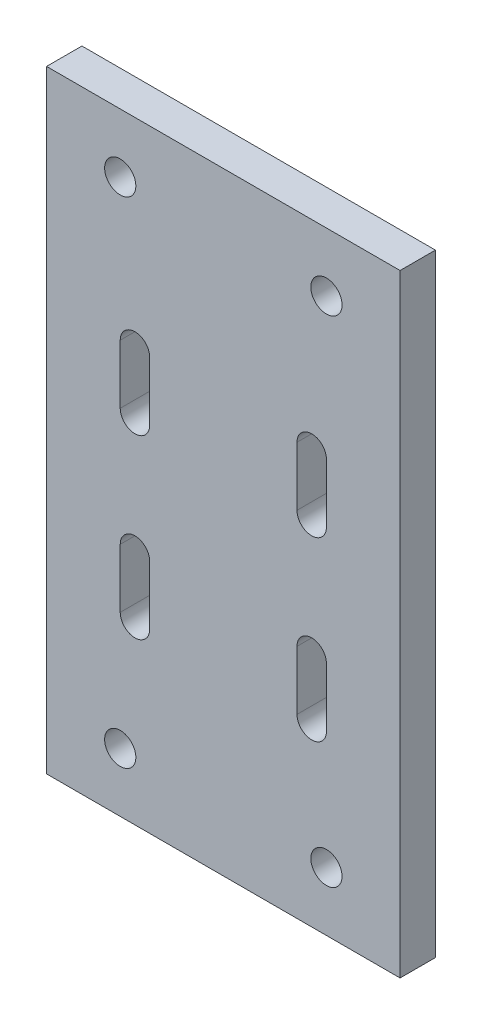
ISO-10303-21;
HEADER;
FILE_DESCRIPTION(('STEP AP214'),'2;1');
FILE_NAME('part.step','',(''),(''),'','','');
FILE_SCHEMA(('AUTOMOTIVE_DESIGN { 1 0 10303 214 1 1 1 1 }'));
ENDSEC;
DATA;
#1=APPLICATION_CONTEXT('core data for automotive mechanical design processes');
#2=APPLICATION_PROTOCOL_DEFINITION('international standard','automotive_design',2000,#1);
#3=PRODUCT_CONTEXT('',#1,'mechanical');
#4=PRODUCT('Part','Part','',(#3));
#5=PRODUCT_RELATED_PRODUCT_CATEGORY('part','',(#4));
#6=PRODUCT_DEFINITION_FORMATION('','',#4);
#7=PRODUCT_DEFINITION_CONTEXT('part definition',#1,'design');
#8=PRODUCT_DEFINITION('design','',#6,#7);
#9=PRODUCT_DEFINITION_SHAPE('','',#8);
#10=(LENGTH_UNIT() NAMED_UNIT(*) SI_UNIT(.MILLI.,.METRE.));
#11=(NAMED_UNIT(*) PLANE_ANGLE_UNIT() SI_UNIT($,.RADIAN.));
#12=(NAMED_UNIT(*) SI_UNIT($,.STERADIAN.) SOLID_ANGLE_UNIT());
#13=UNCERTAINTY_MEASURE_WITH_UNIT(LENGTH_MEASURE(1.E-05),#10,'distance_accuracy_value','');
#14=(GEOMETRIC_REPRESENTATION_CONTEXT(3) GLOBAL_UNCERTAINTY_ASSIGNED_CONTEXT((#13)) GLOBAL_UNIT_ASSIGNED_CONTEXT((#10,
#11,#12)) REPRESENTATION_CONTEXT('',''));
#15=CARTESIAN_POINT('',(0.,0.,0.));
#16=DIRECTION('',(0.,0.,1.));
#17=DIRECTION('',(1.,0.,0.));
#18=AXIS2_PLACEMENT_3D('',#15,#16,#17);
#19=CARTESIAN_POINT('',(30.,52.,6.));
#20=DIRECTION('',(-1.,0.,0.));
#21=DIRECTION('',(0.,-1.,0.));
#22=AXIS2_PLACEMENT_3D('',#19,#20,#21);
#23=PLANE('',#22);
#24=DIRECTION('',(0.,1.,0.));
#25=VECTOR('',#24,1.);
#26=CARTESIAN_POINT('',(30.,52.,0.));
#27=LINE('',#26,#25);
#28=CARTESIAN_POINT('',(30.,-52.,0.));
#29=VERTEX_POINT('',#28);
#30=CARTESIAN_POINT('',(30.,52.,0.));
#31=VERTEX_POINT('',#30);
#32=EDGE_CURVE('E300',#29,#31,#27,.T.);
#33=ORIENTED_EDGE('',*,*,#32,.T.);
#34=DIRECTION('',(0.,0.,-1.));
#35=VECTOR('',#34,1.);
#36=CARTESIAN_POINT('',(30.,52.,6.));
#37=LINE('',#36,#35);
#38=CARTESIAN_POINT('',(30.,52.,6.));
#39=VERTEX_POINT('',#38);
#40=EDGE_CURVE('E11',#39,#31,#37,.T.);
#41=ORIENTED_EDGE('',*,*,#40,.F.);
#42=DIRECTION('',(0.,1.,0.));
#43=VECTOR('',#42,1.);
#44=CARTESIAN_POINT('',(30.,52.,6.));
#45=LINE('',#44,#43);
#46=CARTESIAN_POINT('',(30.,-52.,6.));
#47=VERTEX_POINT('',#46);
#48=EDGE_CURVE('E307',#47,#39,#45,.T.);
#49=ORIENTED_EDGE('',*,*,#48,.F.);
#50=DIRECTION('',(0.,0.,-1.));
#51=VECTOR('',#50,1.);
#52=CARTESIAN_POINT('',(30.,-52.,6.));
#53=LINE('',#52,#51);
#54=EDGE_CURVE('E317',#47,#29,#53,.T.);
#55=ORIENTED_EDGE('',*,*,#54,.T.);
#56=EDGE_LOOP('',(#33,#41,#49,#55));
#57=FACE_BOUND('',#56,.T.);
#58=ADVANCED_FACE('F33',(#57),#23,.F.);
#59=CARTESIAN_POINT('',(-30.,52.,6.));
#60=DIRECTION('',(0.,-1.,0.));
#61=DIRECTION('',(0.,0.,-1.));
#62=AXIS2_PLACEMENT_3D('',#59,#60,#61);
#63=PLANE('',#62);
#64=DIRECTION('',(-1.,0.,0.));
#65=VECTOR('',#64,1.);
#66=CARTESIAN_POINT('',(-30.,52.,0.));
#67=LINE('',#66,#65);
#68=CARTESIAN_POINT('',(-30.,52.,0.));
#69=VERTEX_POINT('',#68);
#70=EDGE_CURVE('E320',#31,#69,#67,.T.);
#71=ORIENTED_EDGE('',*,*,#70,.T.);
#72=DIRECTION('',(0.,0.,-1.));
#73=VECTOR('',#72,1.);
#74=CARTESIAN_POINT('',(-30.,52.,6.));
#75=LINE('',#74,#73);
#76=CARTESIAN_POINT('',(-30.,52.,6.));
#77=VERTEX_POINT('',#76);
#78=EDGE_CURVE('E40',#77,#69,#75,.T.);
#79=ORIENTED_EDGE('',*,*,#78,.F.);
#80=DIRECTION('',(-1.,0.,0.));
#81=VECTOR('',#80,1.);
#82=CARTESIAN_POINT('',(-30.,52.,6.));
#83=LINE('',#82,#81);
#84=EDGE_CURVE('E310',#39,#77,#83,.T.);
#85=ORIENTED_EDGE('',*,*,#84,.F.);
#86=ORIENTED_EDGE('',*,*,#40,.T.);
#87=EDGE_LOOP('',(#71,#79,#85,#86));
#88=FACE_BOUND('',#87,.T.);
#89=ADVANCED_FACE('F349',(#88),#63,.F.);
#90=CARTESIAN_POINT('',(-30.,52.,6.));
#91=DIRECTION('',(1.,0.,0.));
#92=DIRECTION('',(0.,1.,0.));
#93=AXIS2_PLACEMENT_3D('',#90,#91,#92);
#94=PLANE('',#93);
#95=DIRECTION('',(0.,-1.,0.));
#96=VECTOR('',#95,1.);
#97=CARTESIAN_POINT('',(-30.,52.,0.));
#98=LINE('',#97,#96);
#99=CARTESIAN_POINT('',(-30.,-52.,0.));
#100=VERTEX_POINT('',#99);
#101=EDGE_CURVE('E322',#69,#100,#98,.T.);
#102=ORIENTED_EDGE('',*,*,#101,.T.);
#103=DIRECTION('',(0.,0.,-1.));
#104=VECTOR('',#103,1.);
#105=CARTESIAN_POINT('',(-30.,-52.,6.));
#106=LINE('',#105,#104);
#107=CARTESIAN_POINT('',(-30.,-52.,6.));
#108=VERTEX_POINT('',#107);
#109=EDGE_CURVE('E327',#108,#100,#106,.T.);
#110=ORIENTED_EDGE('',*,*,#109,.F.);
#111=DIRECTION('',(0.,-1.,0.));
#112=VECTOR('',#111,1.);
#113=CARTESIAN_POINT('',(-30.,52.,6.));
#114=LINE('',#113,#112);
#115=EDGE_CURVE('E313',#77,#108,#114,.T.);
#116=ORIENTED_EDGE('',*,*,#115,.F.);
#117=ORIENTED_EDGE('',*,*,#78,.T.);
#118=EDGE_LOOP('',(#102,#110,#116,#117));
#119=FACE_BOUND('',#118,.T.);
#120=ADVANCED_FACE('F334',(#119),#94,.F.);
#121=CARTESIAN_POINT('',(-30.,-52.,6.));
#122=DIRECTION('',(0.,1.,0.));
#123=DIRECTION('',(0.,0.,1.));
#124=AXIS2_PLACEMENT_3D('',#121,#122,#123);
#125=PLANE('',#124);
#126=DIRECTION('',(1.,0.,0.));
#127=VECTOR('',#126,1.);
#128=CARTESIAN_POINT('',(-30.,-52.,0.));
#129=LINE('',#128,#127);
#130=EDGE_CURVE('E311',#100,#29,#129,.T.);
#131=ORIENTED_EDGE('',*,*,#130,.T.);
#132=ORIENTED_EDGE('',*,*,#54,.F.);
#133=DIRECTION('',(1.,0.,0.));
#134=VECTOR('',#133,1.);
#135=CARTESIAN_POINT('',(-30.,-52.,6.));
#136=LINE('',#135,#134);
#137=EDGE_CURVE('E315',#108,#47,#136,.T.);
#138=ORIENTED_EDGE('',*,*,#137,.F.);
#139=ORIENTED_EDGE('',*,*,#109,.T.);
#140=EDGE_LOOP('',(#131,#132,#138,#139));
#141=FACE_BOUND('',#140,.T.);
#142=ADVANCED_FACE('F342',(#141),#125,.F.);
#143=CARTESIAN_POINT('',(0.,0.,6.));
#144=DIRECTION('',(0.,0.,1.));
#145=DIRECTION('',(1.,0.,0.));
#146=AXIS2_PLACEMENT_3D('',#143,#144,#145);
#147=PLANE('',#146);
#148=CARTESIAN_POINT('',(-17.5,-42.,6.));
#149=DIRECTION('',(0.,0.,1.));
#150=DIRECTION('',(1.,0.,0.));
#151=AXIS2_PLACEMENT_3D('',#148,#149,#150);
#152=CIRCLE('',#151,2.65);
#153=CARTESIAN_POINT('',(-14.85,-42.,6.));
#154=VERTEX_POINT('',#153);
#155=EDGE_CURVE('E447',#154,#154,#152,.T.);
#156=ORIENTED_EDGE('',*,*,#155,.F.);
#157=EDGE_LOOP('',(#156));
#158=FACE_BOUND('',#157,.T.);
#159=CARTESIAN_POINT('',(17.5,-42.,6.));
#160=DIRECTION('',(0.,0.,1.));
#161=DIRECTION('',(-1.,0.,0.));
#162=AXIS2_PLACEMENT_3D('',#159,#160,#161);
#163=CIRCLE('',#162,2.65);
#164=CARTESIAN_POINT('',(14.85,-42.,6.));
#165=VERTEX_POINT('',#164);
#166=EDGE_CURVE('E452',#165,#165,#163,.T.);
#167=ORIENTED_EDGE('',*,*,#166,.F.);
#168=EDGE_LOOP('',(#167));
#169=FACE_BOUND('',#168,.T.);
#170=CARTESIAN_POINT('',(17.5,42.,6.));
#171=DIRECTION('',(0.,0.,1.));
#172=DIRECTION('',(-1.,0.,0.));
#173=AXIS2_PLACEMENT_3D('',#170,#171,#172);
#174=CIRCLE('',#173,2.65);
#175=CARTESIAN_POINT('',(14.85,42.,6.));
#176=VERTEX_POINT('',#175);
#177=EDGE_CURVE('E460',#176,#176,#174,.T.);
#178=ORIENTED_EDGE('',*,*,#177,.F.);
#179=EDGE_LOOP('',(#178));
#180=FACE_BOUND('',#179,.T.);
#181=CARTESIAN_POINT('',(-17.5,42.,6.));
#182=DIRECTION('',(0.,0.,1.));
#183=DIRECTION('',(1.,0.,0.));
#184=AXIS2_PLACEMENT_3D('',#181,#182,#183);
#185=CIRCLE('',#184,2.65);
#186=CARTESIAN_POINT('',(-14.85,42.,6.));
#187=VERTEX_POINT('',#186);
#188=EDGE_CURVE('E196',#187,#187,#185,.T.);
#189=ORIENTED_EDGE('',*,*,#188,.F.);
#190=EDGE_LOOP('',(#189));
#191=FACE_BOUND('',#190,.T.);
#192=CARTESIAN_POINT('',(15.,18.,6.));
#193=DIRECTION('',(0.,0.,1.));
#194=DIRECTION('',(1.,0.,0.));
#195=AXIS2_PLACEMENT_3D('',#192,#193,#194);
#196=CIRCLE('',#195,2.50000000000001);
#197=CARTESIAN_POINT('',(17.5,18.,6.));
#198=VERTEX_POINT('',#197);
#199=CARTESIAN_POINT('',(12.5,18.,6.));
#200=VERTEX_POINT('',#199);
#201=EDGE_CURVE('E47',#198,#200,#196,.T.);
#202=ORIENTED_EDGE('',*,*,#201,.F.);
#203=DIRECTION('',(0.,1.,0.));
#204=VECTOR('',#203,1.);
#205=CARTESIAN_POINT('',(17.5,18.,6.));
#206=LINE('',#205,#204);
#207=CARTESIAN_POINT('',(17.5,8.00000000000002,6.));
#208=VERTEX_POINT('',#207);
#209=EDGE_CURVE('E190',#208,#198,#206,.T.);
#210=ORIENTED_EDGE('',*,*,#209,.F.);
#211=CARTESIAN_POINT('',(15.,8.00000000000002,6.));
#212=DIRECTION('',(0.,0.,1.));
#213=DIRECTION('',(1.,0.,0.));
#214=AXIS2_PLACEMENT_3D('',#211,#212,#213);
#215=CIRCLE('',#214,2.50000000000001);
#216=CARTESIAN_POINT('',(12.5,8.00000000000002,6.));
#217=VERTEX_POINT('',#216);
#218=EDGE_CURVE('E193',#217,#208,#215,.T.);
#219=ORIENTED_EDGE('',*,*,#218,.F.);
#220=DIRECTION('',(0.,-1.,0.));
#221=VECTOR('',#220,1.);
#222=CARTESIAN_POINT('',(12.5,18.,6.));
#223=LINE('',#222,#221);
#224=EDGE_CURVE('E202',#200,#217,#223,.T.);
#225=ORIENTED_EDGE('',*,*,#224,.F.);
#226=EDGE_LOOP('',(#202,#210,#219,#225));
#227=FACE_BOUND('',#226,.T.);
#228=CARTESIAN_POINT('',(15.,-12.,6.));
#229=DIRECTION('',(0.,0.,1.));
#230=DIRECTION('',(1.,0.,0.));
#231=AXIS2_PLACEMENT_3D('',#228,#229,#230);
#232=CIRCLE('',#231,2.49999999999997);
#233=CARTESIAN_POINT('',(17.5,-12.,6.));
#234=VERTEX_POINT('',#233);
#235=CARTESIAN_POINT('',(12.5,-12.,6.));
#236=VERTEX_POINT('',#235);
#237=EDGE_CURVE('E55',#234,#236,#232,.T.);
#238=ORIENTED_EDGE('',*,*,#237,.F.);
#239=DIRECTION('',(0.,1.,0.));
#240=VECTOR('',#239,1.);
#241=CARTESIAN_POINT('',(17.5,-12.,6.));
#242=LINE('',#241,#240);
#243=CARTESIAN_POINT('',(17.5,-22.,6.));
#244=VERTEX_POINT('',#243);
#245=EDGE_CURVE('E217',#244,#234,#242,.T.);
#246=ORIENTED_EDGE('',*,*,#245,.F.);
#247=CARTESIAN_POINT('',(15.,-22.,6.));
#248=DIRECTION('',(0.,0.,1.));
#249=DIRECTION('',(1.,0.,0.));
#250=AXIS2_PLACEMENT_3D('',#247,#248,#249);
#251=CIRCLE('',#250,2.49999999999997);
#252=CARTESIAN_POINT('',(12.5,-22.,6.));
#253=VERTEX_POINT('',#252);
#254=EDGE_CURVE('E232',#253,#244,#251,.T.);
#255=ORIENTED_EDGE('',*,*,#254,.F.);
#256=DIRECTION('',(0.,-1.,0.));
#257=VECTOR('',#256,1.);
#258=CARTESIAN_POINT('',(12.5,-12.,6.));
#259=LINE('',#258,#257);
#260=EDGE_CURVE('E228',#236,#253,#259,.T.);
#261=ORIENTED_EDGE('',*,*,#260,.F.);
#262=EDGE_LOOP('',(#238,#246,#255,#261));
#263=FACE_BOUND('',#262,.T.);
#264=CARTESIAN_POINT('',(-15.,-12.,6.));
#265=DIRECTION('',(0.,0.,1.));
#266=DIRECTION('',(1.,0.,0.));
#267=AXIS2_PLACEMENT_3D('',#264,#265,#266);
#268=CIRCLE('',#267,2.5);
#269=CARTESIAN_POINT('',(-12.5,-12.,6.));
#270=VERTEX_POINT('',#269);
#271=CARTESIAN_POINT('',(-17.5,-12.,6.));
#272=VERTEX_POINT('',#271);
#273=EDGE_CURVE('E257',#270,#272,#268,.T.);
#274=ORIENTED_EDGE('',*,*,#273,.F.);
#275=DIRECTION('',(0.,1.,0.));
#276=VECTOR('',#275,1.);
#277=CARTESIAN_POINT('',(-12.5,-12.,6.));
#278=LINE('',#277,#276);
#279=CARTESIAN_POINT('',(-12.5,-22.,6.));
#280=VERTEX_POINT('',#279);
#281=EDGE_CURVE('E247',#280,#270,#278,.T.);
#282=ORIENTED_EDGE('',*,*,#281,.F.);
#283=CARTESIAN_POINT('',(-15.,-22.,6.));
#284=DIRECTION('',(0.,0.,1.));
#285=DIRECTION('',(1.,0.,0.));
#286=AXIS2_PLACEMENT_3D('',#283,#284,#285);
#287=CIRCLE('',#286,2.5);
#288=CARTESIAN_POINT('',(-17.5,-22.,6.));
#289=VERTEX_POINT('',#288);
#290=EDGE_CURVE('E263',#289,#280,#287,.T.);
#291=ORIENTED_EDGE('',*,*,#290,.F.);
#292=DIRECTION('',(0.,-1.,0.));
#293=VECTOR('',#292,1.);
#294=CARTESIAN_POINT('',(-17.5,-12.,6.));
#295=LINE('',#294,#293);
#296=EDGE_CURVE('E259',#272,#289,#295,.T.);
#297=ORIENTED_EDGE('',*,*,#296,.F.);
#298=EDGE_LOOP('',(#274,#282,#291,#297));
#299=FACE_BOUND('',#298,.T.);
#300=CARTESIAN_POINT('',(-15.,18.,6.));
#301=DIRECTION('',(0.,0.,1.));
#302=DIRECTION('',(1.,0.,0.));
#303=AXIS2_PLACEMENT_3D('',#300,#301,#302);
#304=CIRCLE('',#303,2.50000000000001);
#305=CARTESIAN_POINT('',(-12.5,18.,6.));
#306=VERTEX_POINT('',#305);
#307=CARTESIAN_POINT('',(-17.5,18.,6.));
#308=VERTEX_POINT('',#307);
#309=EDGE_CURVE('E209',#306,#308,#304,.T.);
#310=ORIENTED_EDGE('',*,*,#309,.F.);
#311=DIRECTION('',(0.,1.,0.));
#312=VECTOR('',#311,1.);
#313=CARTESIAN_POINT('',(-12.5,18.,6.));
#314=LINE('',#313,#312);
#315=CARTESIAN_POINT('',(-12.5,8.00000000000001,6.));
#316=VERTEX_POINT('',#315);
#317=EDGE_CURVE('E279',#316,#306,#314,.T.);
#318=ORIENTED_EDGE('',*,*,#317,.F.);
#319=CARTESIAN_POINT('',(-15.,8.00000000000001,6.));
#320=DIRECTION('',(0.,0.,1.));
#321=DIRECTION('',(1.,0.,0.));
#322=AXIS2_PLACEMENT_3D('',#319,#320,#321);
#323=CIRCLE('',#322,2.50000000000001);
#324=CARTESIAN_POINT('',(-17.5,8.00000000000001,6.));
#325=VERTEX_POINT('',#324);
#326=EDGE_CURVE('E293',#325,#316,#323,.T.);
#327=ORIENTED_EDGE('',*,*,#326,.F.);
#328=DIRECTION('',(0.,-1.,0.));
#329=VECTOR('',#328,1.);
#330=CARTESIAN_POINT('',(-17.5,18.,6.));
#331=LINE('',#330,#329);
#332=EDGE_CURVE('E290',#308,#325,#331,.T.);
#333=ORIENTED_EDGE('',*,*,#332,.F.);
#334=EDGE_LOOP('',(#310,#318,#327,#333));
#335=FACE_BOUND('',#334,.T.);
#336=ORIENTED_EDGE('',*,*,#48,.T.);
#337=ORIENTED_EDGE('',*,*,#84,.T.);
#338=ORIENTED_EDGE('',*,*,#115,.T.);
#339=ORIENTED_EDGE('',*,*,#137,.T.);
#340=EDGE_LOOP('',(#336,#337,#338,#339));
#341=FACE_BOUND('',#340,.T.);
#342=ADVANCED_FACE('F348',(#158,#169,#180,#191,#227,#263,#299,#335,#341),#147,.T.);
#343=CARTESIAN_POINT('',(0.,0.,0.));
#344=DIRECTION('',(0.,0.,1.));
#345=DIRECTION('',(1.,0.,0.));
#346=AXIS2_PLACEMENT_3D('',#343,#344,#345);
#347=PLANE('',#346);
#348=CARTESIAN_POINT('',(-17.5,-42.,0.));
#349=DIRECTION('',(0.,0.,1.));
#350=DIRECTION('',(1.,0.,0.));
#351=AXIS2_PLACEMENT_3D('',#348,#349,#350);
#352=CIRCLE('',#351,2.65);
#353=CARTESIAN_POINT('',(-14.85,-42.,0.));
#354=VERTEX_POINT('',#353);
#355=EDGE_CURVE('E444',#354,#354,#352,.T.);
#356=ORIENTED_EDGE('',*,*,#355,.T.);
#357=EDGE_LOOP('',(#356));
#358=FACE_BOUND('',#357,.T.);
#359=CARTESIAN_POINT('',(17.5,-42.,0.));
#360=DIRECTION('',(0.,0.,1.));
#361=DIRECTION('',(-1.,0.,0.));
#362=AXIS2_PLACEMENT_3D('',#359,#360,#361);
#363=CIRCLE('',#362,2.65);
#364=CARTESIAN_POINT('',(14.85,-42.,0.));
#365=VERTEX_POINT('',#364);
#366=EDGE_CURVE('E448',#365,#365,#363,.T.);
#367=ORIENTED_EDGE('',*,*,#366,.T.);
#368=EDGE_LOOP('',(#367));
#369=FACE_BOUND('',#368,.T.);
#370=CARTESIAN_POINT('',(17.5,42.,0.));
#371=DIRECTION('',(0.,0.,1.));
#372=DIRECTION('',(-1.,0.,0.));
#373=AXIS2_PLACEMENT_3D('',#370,#371,#372);
#374=CIRCLE('',#373,2.65);
#375=CARTESIAN_POINT('',(14.85,42.,0.));
#376=VERTEX_POINT('',#375);
#377=EDGE_CURVE('E457',#376,#376,#374,.T.);
#378=ORIENTED_EDGE('',*,*,#377,.T.);
#379=EDGE_LOOP('',(#378));
#380=FACE_BOUND('',#379,.T.);
#381=CARTESIAN_POINT('',(-17.5,42.,0.));
#382=DIRECTION('',(0.,0.,1.));
#383=DIRECTION('',(1.,0.,0.));
#384=AXIS2_PLACEMENT_3D('',#381,#382,#383);
#385=CIRCLE('',#384,2.65);
#386=CARTESIAN_POINT('',(-14.85,42.,0.));
#387=VERTEX_POINT('',#386);
#388=EDGE_CURVE('E260',#387,#387,#385,.T.);
#389=ORIENTED_EDGE('',*,*,#388,.T.);
#390=EDGE_LOOP('',(#389));
#391=FACE_BOUND('',#390,.T.);
#392=DIRECTION('',(0.,1.,0.));
#393=VECTOR('',#392,1.);
#394=CARTESIAN_POINT('',(17.5,18.,0.));
#395=LINE('',#394,#393);
#396=CARTESIAN_POINT('',(17.5,8.00000000000002,0.));
#397=VERTEX_POINT('',#396);
#398=CARTESIAN_POINT('',(17.5,18.,0.));
#399=VERTEX_POINT('',#398);
#400=EDGE_CURVE('E177',#397,#399,#395,.T.);
#401=ORIENTED_EDGE('',*,*,#400,.T.);
#402=CARTESIAN_POINT('',(15.,18.,0.));
#403=DIRECTION('',(0.,0.,1.));
#404=DIRECTION('',(1.,0.,0.));
#405=AXIS2_PLACEMENT_3D('',#402,#403,#404);
#406=CIRCLE('',#405,2.50000000000001);
#407=CARTESIAN_POINT('',(12.5,18.,0.));
#408=VERTEX_POINT('',#407);
#409=EDGE_CURVE('E171',#399,#408,#406,.T.);
#410=ORIENTED_EDGE('',*,*,#409,.T.);
#411=DIRECTION('',(0.,-1.,0.));
#412=VECTOR('',#411,1.);
#413=CARTESIAN_POINT('',(12.5,18.,0.));
#414=LINE('',#413,#412);
#415=CARTESIAN_POINT('',(12.5,8.00000000000002,0.));
#416=VERTEX_POINT('',#415);
#417=EDGE_CURVE('E181',#408,#416,#414,.T.);
#418=ORIENTED_EDGE('',*,*,#417,.T.);
#419=CARTESIAN_POINT('',(15.,8.00000000000002,0.));
#420=DIRECTION('',(0.,0.,1.));
#421=DIRECTION('',(1.,0.,0.));
#422=AXIS2_PLACEMENT_3D('',#419,#420,#421);
#423=CIRCLE('',#422,2.50000000000001);
#424=EDGE_CURVE('E185',#416,#397,#423,.T.);
#425=ORIENTED_EDGE('',*,*,#424,.T.);
#426=EDGE_LOOP('',(#401,#410,#418,#425));
#427=FACE_BOUND('',#426,.T.);
#428=DIRECTION('',(0.,1.,0.));
#429=VECTOR('',#428,1.);
#430=CARTESIAN_POINT('',(17.5,-12.,0.));
#431=LINE('',#430,#429);
#432=CARTESIAN_POINT('',(17.5,-22.,0.));
#433=VERTEX_POINT('',#432);
#434=CARTESIAN_POINT('',(17.5,-12.,0.));
#435=VERTEX_POINT('',#434);
#436=EDGE_CURVE('E223',#433,#435,#431,.T.);
#437=ORIENTED_EDGE('',*,*,#436,.T.);
#438=CARTESIAN_POINT('',(15.,-12.,0.));
#439=DIRECTION('',(0.,0.,1.));
#440=DIRECTION('',(1.,0.,0.));
#441=AXIS2_PLACEMENT_3D('',#438,#439,#440);
#442=CIRCLE('',#441,2.49999999999997);
#443=CARTESIAN_POINT('',(12.5,-12.,0.));
#444=VERTEX_POINT('',#443);
#445=EDGE_CURVE('E213',#435,#444,#442,.T.);
#446=ORIENTED_EDGE('',*,*,#445,.T.);
#447=DIRECTION('',(0.,-1.,0.));
#448=VECTOR('',#447,1.);
#449=CARTESIAN_POINT('',(12.5,-12.,0.));
#450=LINE('',#449,#448);
#451=CARTESIAN_POINT('',(12.5,-22.,0.));
#452=VERTEX_POINT('',#451);
#453=EDGE_CURVE('E216',#444,#452,#450,.T.);
#454=ORIENTED_EDGE('',*,*,#453,.T.);
#455=CARTESIAN_POINT('',(15.,-22.,0.));
#456=DIRECTION('',(0.,0.,1.));
#457=DIRECTION('',(1.,0.,0.));
#458=AXIS2_PLACEMENT_3D('',#455,#456,#457);
#459=CIRCLE('',#458,2.49999999999997);
#460=EDGE_CURVE('E220',#452,#433,#459,.T.);
#461=ORIENTED_EDGE('',*,*,#460,.T.);
#462=EDGE_LOOP('',(#437,#446,#454,#461));
#463=FACE_BOUND('',#462,.T.);
#464=DIRECTION('',(0.,1.,0.));
#465=VECTOR('',#464,1.);
#466=CARTESIAN_POINT('',(-12.5,-12.,0.));
#467=LINE('',#466,#465);
#468=CARTESIAN_POINT('',(-12.5,-22.,0.));
#469=VERTEX_POINT('',#468);
#470=CARTESIAN_POINT('',(-12.5,-12.,0.));
#471=VERTEX_POINT('',#470);
#472=EDGE_CURVE('E253',#469,#471,#467,.T.);
#473=ORIENTED_EDGE('',*,*,#472,.T.);
#474=CARTESIAN_POINT('',(-15.,-12.,0.));
#475=DIRECTION('',(0.,0.,1.));
#476=DIRECTION('',(1.,0.,0.));
#477=AXIS2_PLACEMENT_3D('',#474,#475,#476);
#478=CIRCLE('',#477,2.5);
#479=CARTESIAN_POINT('',(-17.5,-12.,0.));
#480=VERTEX_POINT('',#479);
#481=EDGE_CURVE('E243',#471,#480,#478,.T.);
#482=ORIENTED_EDGE('',*,*,#481,.T.);
#483=DIRECTION('',(0.,-1.,0.));
#484=VECTOR('',#483,1.);
#485=CARTESIAN_POINT('',(-17.5,-12.,0.));
#486=LINE('',#485,#484);
#487=CARTESIAN_POINT('',(-17.5,-22.,0.));
#488=VERTEX_POINT('',#487);
#489=EDGE_CURVE('E246',#480,#488,#486,.T.);
#490=ORIENTED_EDGE('',*,*,#489,.T.);
#491=CARTESIAN_POINT('',(-15.,-22.,0.));
#492=DIRECTION('',(0.,0.,1.));
#493=DIRECTION('',(1.,0.,0.));
#494=AXIS2_PLACEMENT_3D('',#491,#492,#493);
#495=CIRCLE('',#494,2.5);
#496=EDGE_CURVE('E250',#488,#469,#495,.T.);
#497=ORIENTED_EDGE('',*,*,#496,.T.);
#498=EDGE_LOOP('',(#473,#482,#490,#497));
#499=FACE_BOUND('',#498,.T.);
#500=DIRECTION('',(0.,1.,0.));
#501=VECTOR('',#500,1.);
#502=CARTESIAN_POINT('',(-12.5,18.,0.));
#503=LINE('',#502,#501);
#504=CARTESIAN_POINT('',(-12.5,8.00000000000001,0.));
#505=VERTEX_POINT('',#504);
#506=CARTESIAN_POINT('',(-12.5,18.,0.));
#507=VERTEX_POINT('',#506);
#508=EDGE_CURVE('E285',#505,#507,#503,.T.);
#509=ORIENTED_EDGE('',*,*,#508,.T.);
#510=CARTESIAN_POINT('',(-15.,18.,0.));
#511=DIRECTION('',(0.,0.,1.));
#512=DIRECTION('',(1.,0.,0.));
#513=AXIS2_PLACEMENT_3D('',#510,#511,#512);
#514=CIRCLE('',#513,2.50000000000001);
#515=CARTESIAN_POINT('',(-17.5,18.,0.));
#516=VERTEX_POINT('',#515);
#517=EDGE_CURVE('E275',#507,#516,#514,.T.);
#518=ORIENTED_EDGE('',*,*,#517,.T.);
#519=DIRECTION('',(0.,-1.,0.));
#520=VECTOR('',#519,1.);
#521=CARTESIAN_POINT('',(-17.5,18.,0.));
#522=LINE('',#521,#520);
#523=CARTESIAN_POINT('',(-17.5,8.00000000000001,0.));
#524=VERTEX_POINT('',#523);
#525=EDGE_CURVE('E278',#516,#524,#522,.T.);
#526=ORIENTED_EDGE('',*,*,#525,.T.);
#527=CARTESIAN_POINT('',(-15.,8.00000000000001,0.));
#528=DIRECTION('',(0.,0.,1.));
#529=DIRECTION('',(1.,0.,0.));
#530=AXIS2_PLACEMENT_3D('',#527,#528,#529);
#531=CIRCLE('',#530,2.50000000000001);
#532=EDGE_CURVE('E282',#524,#505,#531,.T.);
#533=ORIENTED_EDGE('',*,*,#532,.T.);
#534=EDGE_LOOP('',(#509,#518,#526,#533));
#535=FACE_BOUND('',#534,.T.);
#536=ORIENTED_EDGE('',*,*,#32,.F.);
#537=ORIENTED_EDGE('',*,*,#130,.F.);
#538=ORIENTED_EDGE('',*,*,#101,.F.);
#539=ORIENTED_EDGE('',*,*,#70,.F.);
#540=EDGE_LOOP('',(#536,#537,#538,#539));
#541=FACE_BOUND('',#540,.T.);
#542=ADVANCED_FACE('F187',(#358,#369,#380,#391,#427,#463,#499,#535,#541),#347,.F.);
#543=CARTESIAN_POINT('',(-15.,18.,0.));
#544=DIRECTION('',(0.,0.,1.));
#545=DIRECTION('',(1.,0.,0.));
#546=AXIS2_PLACEMENT_3D('',#543,#544,#545);
#547=CYLINDRICAL_SURFACE('',#546,2.50000000000001);
#548=ORIENTED_EDGE('',*,*,#309,.T.);
#549=DIRECTION('',(0.,0.,1.));
#550=VECTOR('',#549,1.);
#551=CARTESIAN_POINT('',(-17.5,18.,0.));
#552=LINE('',#551,#550);
#553=EDGE_CURVE('E288',#516,#308,#552,.T.);
#554=ORIENTED_EDGE('',*,*,#553,.F.);
#555=ORIENTED_EDGE('',*,*,#517,.F.);
#556=DIRECTION('',(0.,0.,1.));
#557=VECTOR('',#556,1.);
#558=CARTESIAN_POINT('',(-12.5,18.,0.));
#559=LINE('',#558,#557);
#560=EDGE_CURVE('E298',#507,#306,#559,.T.);
#561=ORIENTED_EDGE('',*,*,#560,.T.);
#562=EDGE_LOOP('',(#548,#554,#555,#561));
#563=FACE_BOUND('',#562,.T.);
#564=ADVANCED_FACE('F361',(#563),#547,.F.);
#565=CARTESIAN_POINT('',(-12.5,18.,0.));
#566=DIRECTION('',(1.,0.,0.));
#567=DIRECTION('',(0.,1.,0.));
#568=AXIS2_PLACEMENT_3D('',#565,#566,#567);
#569=PLANE('',#568);
#570=ORIENTED_EDGE('',*,*,#317,.T.);
#571=ORIENTED_EDGE('',*,*,#560,.F.);
#572=ORIENTED_EDGE('',*,*,#508,.F.);
#573=DIRECTION('',(0.,0.,1.));
#574=VECTOR('',#573,1.);
#575=CARTESIAN_POINT('',(-12.5,8.00000000000001,0.));
#576=LINE('',#575,#574);
#577=EDGE_CURVE('E301',#505,#316,#576,.T.);
#578=ORIENTED_EDGE('',*,*,#577,.T.);
#579=EDGE_LOOP('',(#570,#571,#572,#578));
#580=FACE_BOUND('',#579,.T.);
#581=ADVANCED_FACE('F368',(#580),#569,.F.);
#582=CARTESIAN_POINT('',(-15.,8.00000000000001,0.));
#583=DIRECTION('',(0.,0.,1.));
#584=DIRECTION('',(1.,0.,0.));
#585=AXIS2_PLACEMENT_3D('',#582,#583,#584);
#586=CYLINDRICAL_SURFACE('',#585,2.50000000000001);
#587=ORIENTED_EDGE('',*,*,#326,.T.);
#588=ORIENTED_EDGE('',*,*,#577,.F.);
#589=ORIENTED_EDGE('',*,*,#532,.F.);
#590=DIRECTION('',(0.,0.,1.));
#591=VECTOR('',#590,1.);
#592=CARTESIAN_POINT('',(-17.5,8.00000000000001,0.));
#593=LINE('',#592,#591);
#594=EDGE_CURVE('E303',#524,#325,#593,.T.);
#595=ORIENTED_EDGE('',*,*,#594,.T.);
#596=EDGE_LOOP('',(#587,#588,#589,#595));
#597=FACE_BOUND('',#596,.T.);
#598=ADVANCED_FACE('F374',(#597),#586,.F.);
#599=CARTESIAN_POINT('',(-17.5,18.,0.));
#600=DIRECTION('',(-1.,0.,0.));
#601=DIRECTION('',(0.,-1.,0.));
#602=AXIS2_PLACEMENT_3D('',#599,#600,#601);
#603=PLANE('',#602);
#604=ORIENTED_EDGE('',*,*,#332,.T.);
#605=ORIENTED_EDGE('',*,*,#594,.F.);
#606=ORIENTED_EDGE('',*,*,#525,.F.);
#607=ORIENTED_EDGE('',*,*,#553,.T.);
#608=EDGE_LOOP('',(#604,#605,#606,#607));
#609=FACE_BOUND('',#608,.T.);
#610=ADVANCED_FACE('F370',(#609),#603,.F.);
#611=CARTESIAN_POINT('',(-15.,-12.,0.));
#612=DIRECTION('',(0.,0.,1.));
#613=DIRECTION('',(1.,0.,0.));
#614=AXIS2_PLACEMENT_3D('',#611,#612,#613);
#615=CYLINDRICAL_SURFACE('',#614,2.5);
#616=ORIENTED_EDGE('',*,*,#273,.T.);
#617=DIRECTION('',(0.,0.,1.));
#618=VECTOR('',#617,1.);
#619=CARTESIAN_POINT('',(-17.5,-12.,0.));
#620=LINE('',#619,#618);
#621=EDGE_CURVE('E256',#480,#272,#620,.T.);
#622=ORIENTED_EDGE('',*,*,#621,.F.);
#623=ORIENTED_EDGE('',*,*,#481,.F.);
#624=DIRECTION('',(0.,0.,1.));
#625=VECTOR('',#624,1.);
#626=CARTESIAN_POINT('',(-12.5,-12.,0.));
#627=LINE('',#626,#625);
#628=EDGE_CURVE('E229',#471,#270,#627,.T.);
#629=ORIENTED_EDGE('',*,*,#628,.T.);
#630=EDGE_LOOP('',(#616,#622,#623,#629));
#631=FACE_BOUND('',#630,.T.);
#632=ADVANCED_FACE('F373',(#631),#615,.F.);
#633=CARTESIAN_POINT('',(-12.5,-12.,0.));
#634=DIRECTION('',(1.,0.,0.));
#635=DIRECTION('',(0.,1.,0.));
#636=AXIS2_PLACEMENT_3D('',#633,#634,#635);
#637=PLANE('',#636);
#638=ORIENTED_EDGE('',*,*,#281,.T.);
#639=ORIENTED_EDGE('',*,*,#628,.F.);
#640=ORIENTED_EDGE('',*,*,#472,.F.);
#641=DIRECTION('',(0.,0.,1.));
#642=VECTOR('',#641,1.);
#643=CARTESIAN_POINT('',(-12.5,-22.,0.));
#644=LINE('',#643,#642);
#645=EDGE_CURVE('E269',#469,#280,#644,.T.);
#646=ORIENTED_EDGE('',*,*,#645,.T.);
#647=EDGE_LOOP('',(#638,#639,#640,#646));
#648=FACE_BOUND('',#647,.T.);
#649=ADVANCED_FACE('F384',(#648),#637,.F.);
#650=CARTESIAN_POINT('',(-15.,-22.,0.));
#651=DIRECTION('',(0.,0.,1.));
#652=DIRECTION('',(1.,0.,0.));
#653=AXIS2_PLACEMENT_3D('',#650,#651,#652);
#654=CYLINDRICAL_SURFACE('',#653,2.5);
#655=ORIENTED_EDGE('',*,*,#290,.T.);
#656=ORIENTED_EDGE('',*,*,#645,.F.);
#657=ORIENTED_EDGE('',*,*,#496,.F.);
#658=DIRECTION('',(0.,0.,1.));
#659=VECTOR('',#658,1.);
#660=CARTESIAN_POINT('',(-17.5,-22.,0.));
#661=LINE('',#660,#659);
#662=EDGE_CURVE('E271',#488,#289,#661,.T.);
#663=ORIENTED_EDGE('',*,*,#662,.T.);
#664=EDGE_LOOP('',(#655,#656,#657,#663));
#665=FACE_BOUND('',#664,.T.);
#666=ADVANCED_FACE('F390',(#665),#654,.F.);
#667=CARTESIAN_POINT('',(-17.5,-12.,0.));
#668=DIRECTION('',(-1.,0.,0.));
#669=DIRECTION('',(0.,-1.,0.));
#670=AXIS2_PLACEMENT_3D('',#667,#668,#669);
#671=PLANE('',#670);
#672=ORIENTED_EDGE('',*,*,#296,.T.);
#673=ORIENTED_EDGE('',*,*,#662,.F.);
#674=ORIENTED_EDGE('',*,*,#489,.F.);
#675=ORIENTED_EDGE('',*,*,#621,.T.);
#676=EDGE_LOOP('',(#672,#673,#674,#675));
#677=FACE_BOUND('',#676,.T.);
#678=ADVANCED_FACE('F386',(#677),#671,.F.);
#679=CARTESIAN_POINT('',(15.,-12.,0.));
#680=DIRECTION('',(0.,0.,1.));
#681=DIRECTION('',(1.,0.,0.));
#682=AXIS2_PLACEMENT_3D('',#679,#680,#681);
#683=CYLINDRICAL_SURFACE('',#682,2.49999999999997);
#684=ORIENTED_EDGE('',*,*,#237,.T.);
#685=DIRECTION('',(0.,0.,1.));
#686=VECTOR('',#685,1.);
#687=CARTESIAN_POINT('',(12.5,-12.,0.));
#688=LINE('',#687,#686);
#689=EDGE_CURVE('E226',#444,#236,#688,.T.);
#690=ORIENTED_EDGE('',*,*,#689,.F.);
#691=ORIENTED_EDGE('',*,*,#445,.F.);
#692=DIRECTION('',(0.,0.,1.));
#693=VECTOR('',#692,1.);
#694=CARTESIAN_POINT('',(17.5,-12.,0.));
#695=LINE('',#694,#693);
#696=EDGE_CURVE('E203',#435,#234,#695,.T.);
#697=ORIENTED_EDGE('',*,*,#696,.T.);
#698=EDGE_LOOP('',(#684,#690,#691,#697));
#699=FACE_BOUND('',#698,.T.);
#700=ADVANCED_FACE('F389',(#699),#683,.F.);
#701=CARTESIAN_POINT('',(17.5,-12.,0.));
#702=DIRECTION('',(1.,0.,0.));
#703=DIRECTION('',(0.,1.,0.));
#704=AXIS2_PLACEMENT_3D('',#701,#702,#703);
#705=PLANE('',#704);
#706=ORIENTED_EDGE('',*,*,#245,.T.);
#707=ORIENTED_EDGE('',*,*,#696,.F.);
#708=ORIENTED_EDGE('',*,*,#436,.F.);
#709=DIRECTION('',(0.,0.,1.));
#710=VECTOR('',#709,1.);
#711=CARTESIAN_POINT('',(17.5,-22.,0.));
#712=LINE('',#711,#710);
#713=EDGE_CURVE('E238',#433,#244,#712,.T.);
#714=ORIENTED_EDGE('',*,*,#713,.T.);
#715=EDGE_LOOP('',(#706,#707,#708,#714));
#716=FACE_BOUND('',#715,.T.);
#717=ADVANCED_FACE('F400',(#716),#705,.F.);
#718=CARTESIAN_POINT('',(15.,-22.,0.));
#719=DIRECTION('',(0.,0.,1.));
#720=DIRECTION('',(1.,0.,0.));
#721=AXIS2_PLACEMENT_3D('',#718,#719,#720);
#722=CYLINDRICAL_SURFACE('',#721,2.49999999999997);
#723=ORIENTED_EDGE('',*,*,#254,.T.);
#724=ORIENTED_EDGE('',*,*,#713,.F.);
#725=ORIENTED_EDGE('',*,*,#460,.F.);
#726=DIRECTION('',(0.,0.,1.));
#727=VECTOR('',#726,1.);
#728=CARTESIAN_POINT('',(12.5,-22.,0.));
#729=LINE('',#728,#727);
#730=EDGE_CURVE('E240',#452,#253,#729,.T.);
#731=ORIENTED_EDGE('',*,*,#730,.T.);
#732=EDGE_LOOP('',(#723,#724,#725,#731));
#733=FACE_BOUND('',#732,.T.);
#734=ADVANCED_FACE('F404',(#733),#722,.F.);
#735=CARTESIAN_POINT('',(12.5,-12.,0.));
#736=DIRECTION('',(-1.,0.,0.));
#737=DIRECTION('',(0.,-1.,0.));
#738=AXIS2_PLACEMENT_3D('',#735,#736,#737);
#739=PLANE('',#738);
#740=ORIENTED_EDGE('',*,*,#260,.T.);
#741=ORIENTED_EDGE('',*,*,#730,.F.);
#742=ORIENTED_EDGE('',*,*,#453,.F.);
#743=ORIENTED_EDGE('',*,*,#689,.T.);
#744=EDGE_LOOP('',(#740,#741,#742,#743));
#745=FACE_BOUND('',#744,.T.);
#746=ADVANCED_FACE('F401',(#745),#739,.F.);
#747=CARTESIAN_POINT('',(15.,18.,0.));
#748=DIRECTION('',(0.,0.,1.));
#749=DIRECTION('',(1.,0.,0.));
#750=AXIS2_PLACEMENT_3D('',#747,#748,#749);
#751=CYLINDRICAL_SURFACE('',#750,2.50000000000001);
#752=ORIENTED_EDGE('',*,*,#201,.T.);
#753=DIRECTION('',(0.,0.,1.));
#754=VECTOR('',#753,1.);
#755=CARTESIAN_POINT('',(12.5,18.,0.));
#756=LINE('',#755,#754);
#757=EDGE_CURVE('E167',#408,#200,#756,.T.);
#758=ORIENTED_EDGE('',*,*,#757,.F.);
#759=ORIENTED_EDGE('',*,*,#409,.F.);
#760=DIRECTION('',(0.,0.,1.));
#761=VECTOR('',#760,1.);
#762=CARTESIAN_POINT('',(17.5,18.,0.));
#763=LINE('',#762,#761);
#764=EDGE_CURVE('E207',#399,#198,#763,.T.);
#765=ORIENTED_EDGE('',*,*,#764,.T.);
#766=EDGE_LOOP('',(#752,#758,#759,#765));
#767=FACE_BOUND('',#766,.T.);
#768=ADVANCED_FACE('F169',(#767),#751,.F.);
#769=CARTESIAN_POINT('',(17.5,18.,0.));
#770=DIRECTION('',(1.,0.,0.));
#771=DIRECTION('',(0.,1.,0.));
#772=AXIS2_PLACEMENT_3D('',#769,#770,#771);
#773=PLANE('',#772);
#774=ORIENTED_EDGE('',*,*,#209,.T.);
#775=ORIENTED_EDGE('',*,*,#764,.F.);
#776=ORIENTED_EDGE('',*,*,#400,.F.);
#777=DIRECTION('',(0.,0.,1.));
#778=VECTOR('',#777,1.);
#779=CARTESIAN_POINT('',(17.5,8.00000000000002,0.));
#780=LINE('',#779,#778);
#781=EDGE_CURVE('E210',#397,#208,#780,.T.);
#782=ORIENTED_EDGE('',*,*,#781,.T.);
#783=EDGE_LOOP('',(#774,#775,#776,#782));
#784=FACE_BOUND('',#783,.T.);
#785=ADVANCED_FACE('F414',(#784),#773,.F.);
#786=CARTESIAN_POINT('',(15.,8.00000000000002,0.));
#787=DIRECTION('',(0.,0.,1.));
#788=DIRECTION('',(1.,0.,0.));
#789=AXIS2_PLACEMENT_3D('',#786,#787,#788);
#790=CYLINDRICAL_SURFACE('',#789,2.50000000000001);
#791=ORIENTED_EDGE('',*,*,#218,.T.);
#792=ORIENTED_EDGE('',*,*,#781,.F.);
#793=ORIENTED_EDGE('',*,*,#424,.F.);
#794=DIRECTION('',(0.,0.,1.));
#795=VECTOR('',#794,1.);
#796=CARTESIAN_POINT('',(12.5,8.00000000000002,0.));
#797=LINE('',#796,#795);
#798=EDGE_CURVE('E176',#416,#217,#797,.T.);
#799=ORIENTED_EDGE('',*,*,#798,.T.);
#800=EDGE_LOOP('',(#791,#792,#793,#799));
#801=FACE_BOUND('',#800,.T.);
#802=ADVANCED_FACE('F418',(#801),#790,.F.);
#803=CARTESIAN_POINT('',(12.5,18.,0.));
#804=DIRECTION('',(-1.,0.,0.));
#805=DIRECTION('',(0.,-1.,0.));
#806=AXIS2_PLACEMENT_3D('',#803,#804,#805);
#807=PLANE('',#806);
#808=ORIENTED_EDGE('',*,*,#224,.T.);
#809=ORIENTED_EDGE('',*,*,#798,.F.);
#810=ORIENTED_EDGE('',*,*,#417,.F.);
#811=ORIENTED_EDGE('',*,*,#757,.T.);
#812=EDGE_LOOP('',(#808,#809,#810,#811));
#813=FACE_BOUND('',#812,.T.);
#814=ADVANCED_FACE('F182',(#813),#807,.F.);
#815=CARTESIAN_POINT('',(-17.5,42.,0.));
#816=DIRECTION('',(0.,0.,1.));
#817=DIRECTION('',(1.,0.,0.));
#818=AXIS2_PLACEMENT_3D('',#815,#816,#817);
#819=CYLINDRICAL_SURFACE('',#818,2.65);
#820=ORIENTED_EDGE('',*,*,#388,.F.);
#821=EDGE_LOOP('',(#820));
#822=FACE_BOUND('',#821,.T.);
#823=ORIENTED_EDGE('',*,*,#188,.T.);
#824=EDGE_LOOP('',(#823));
#825=FACE_BOUND('',#824,.T.);
#826=ADVANCED_FACE('F417',(#822,#825),#819,.F.);
#827=CARTESIAN_POINT('',(17.5,42.,0.));
#828=DIRECTION('',(0.,0.,1.));
#829=DIRECTION('',(1.,0.,0.));
#830=AXIS2_PLACEMENT_3D('',#827,#828,#829);
#831=CYLINDRICAL_SURFACE('',#830,2.65);
#832=ORIENTED_EDGE('',*,*,#377,.F.);
#833=EDGE_LOOP('',(#832));
#834=FACE_BOUND('',#833,.T.);
#835=ORIENTED_EDGE('',*,*,#177,.T.);
#836=EDGE_LOOP('',(#835));
#837=FACE_BOUND('',#836,.T.);
#838=ADVANCED_FACE('F427',(#834,#837),#831,.F.);
#839=CARTESIAN_POINT('',(17.5,-42.,0.));
#840=DIRECTION('',(0.,0.,1.));
#841=DIRECTION('',(1.,0.,0.));
#842=AXIS2_PLACEMENT_3D('',#839,#840,#841);
#843=CYLINDRICAL_SURFACE('',#842,2.65);
#844=ORIENTED_EDGE('',*,*,#366,.F.);
#845=EDGE_LOOP('',(#844));
#846=FACE_BOUND('',#845,.T.);
#847=ORIENTED_EDGE('',*,*,#166,.T.);
#848=EDGE_LOOP('',(#847));
#849=FACE_BOUND('',#848,.T.);
#850=ADVANCED_FACE('F431',(#846,#849),#843,.F.);
#851=CARTESIAN_POINT('',(-17.5,-42.,0.));
#852=DIRECTION('',(0.,0.,1.));
#853=DIRECTION('',(1.,0.,0.));
#854=AXIS2_PLACEMENT_3D('',#851,#852,#853);
#855=CYLINDRICAL_SURFACE('',#854,2.65);
#856=ORIENTED_EDGE('',*,*,#355,.F.);
#857=EDGE_LOOP('',(#856));
#858=FACE_BOUND('',#857,.T.);
#859=ORIENTED_EDGE('',*,*,#155,.T.);
#860=EDGE_LOOP('',(#859));
#861=FACE_BOUND('',#860,.T.);
#862=ADVANCED_FACE('F435',(#858,#861),#855,.F.);
#863=CLOSED_SHELL('',(#58,#89,#120,#142,#342,#542,#564,#581,#598,#610,#632,#649,#666,#678,#700,
#717,#734,#746,#768,#785,#802,#814,#826,#838,#850,#862));
#864=MANIFOLD_SOLID_BREP('B2',#863);
#865=ADVANCED_BREP_SHAPE_REPRESENTATION('',(#18,#864),#14);
#866=SHAPE_DEFINITION_REPRESENTATION(#9,#865);
ENDSEC;
END-ISO-10303-21;
